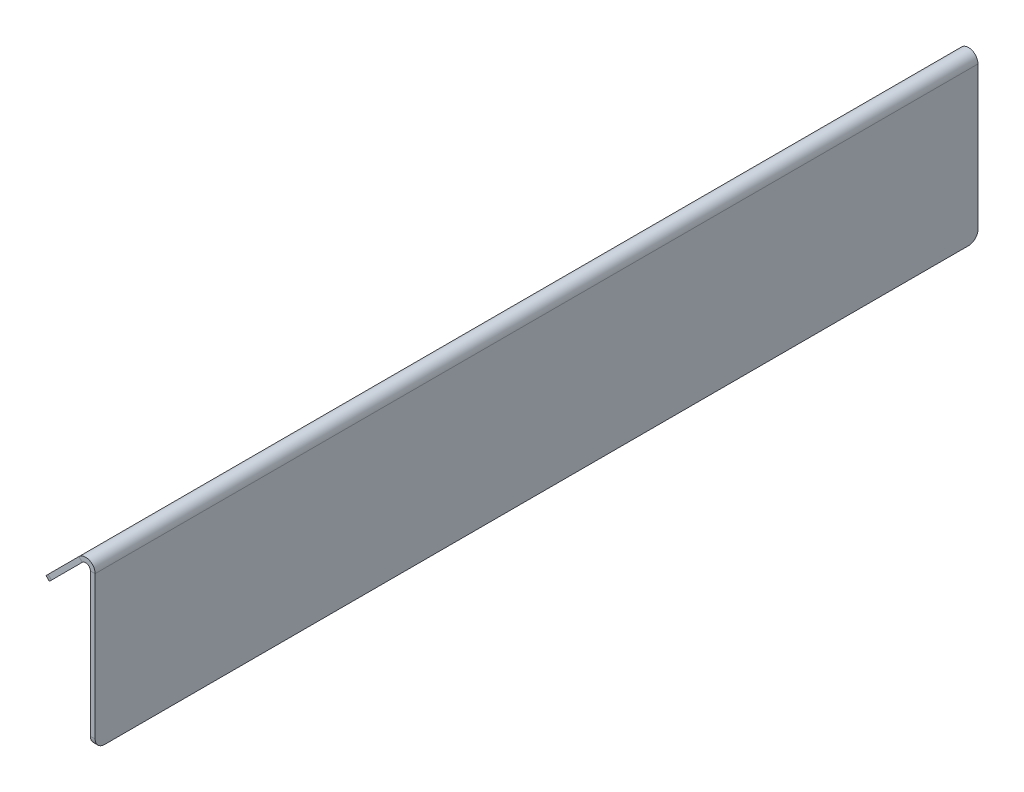
ISO-10303-21;
HEADER;
FILE_DESCRIPTION(('STEP AP214'),'2;1');
FILE_NAME('part.step','',(''),(''),'','','');
FILE_SCHEMA(('AUTOMOTIVE_DESIGN { 1 0 10303 214 1 1 1 1 }'));
ENDSEC;
DATA;
#1=APPLICATION_CONTEXT('core data for automotive mechanical design processes');
#2=APPLICATION_PROTOCOL_DEFINITION('international standard','automotive_design',2000,#1);
#3=PRODUCT_CONTEXT('',#1,'mechanical');
#4=PRODUCT('Part','Part','',(#3));
#5=PRODUCT_RELATED_PRODUCT_CATEGORY('part','',(#4));
#6=PRODUCT_DEFINITION_FORMATION('','',#4);
#7=PRODUCT_DEFINITION_CONTEXT('part definition',#1,'design');
#8=PRODUCT_DEFINITION('design','',#6,#7);
#9=PRODUCT_DEFINITION_SHAPE('','',#8);
#10=(LENGTH_UNIT() NAMED_UNIT(*) SI_UNIT(.MILLI.,.METRE.));
#11=(NAMED_UNIT(*) PLANE_ANGLE_UNIT() SI_UNIT($,.RADIAN.));
#12=(NAMED_UNIT(*) SI_UNIT($,.STERADIAN.) SOLID_ANGLE_UNIT());
#13=UNCERTAINTY_MEASURE_WITH_UNIT(LENGTH_MEASURE(1.E-05),#10,'distance_accuracy_value','');
#14=(GEOMETRIC_REPRESENTATION_CONTEXT(3) GLOBAL_UNCERTAINTY_ASSIGNED_CONTEXT((#13)) GLOBAL_UNIT_ASSIGNED_CONTEXT((#10,
#11,#12)) REPRESENTATION_CONTEXT('',''));
#15=CARTESIAN_POINT('',(0.,0.,0.));
#16=DIRECTION('',(0.,0.,1.));
#17=DIRECTION('',(1.,0.,0.));
#18=AXIS2_PLACEMENT_3D('',#15,#16,#17);
#19=CARTESIAN_POINT('',(-3.175,0.,-590.55));
#20=DIRECTION('',(0.,0.,-1.));
#21=DIRECTION('',(-1.,0.,0.));
#22=AXIS2_PLACEMENT_3D('',#19,#20,#21);
#23=PLANE('',#22);
#24=DIRECTION('',(0.,1.,0.));
#25=VECTOR('',#24,1.);
#26=CARTESIAN_POINT('',(0.,0.,-590.55));
#27=LINE('',#26,#25);
#28=CARTESIAN_POINT('',(0.,6.35,-590.55));
#29=VERTEX_POINT('',#28);
#30=CARTESIAN_POINT('',(0.,102.144743878931,-590.55));
#31=VERTEX_POINT('',#30);
#32=EDGE_CURVE('E216',#29,#31,#27,.T.);
#33=ORIENTED_EDGE('',*,*,#32,.F.);
#34=DIRECTION('',(1.,0.,0.));
#35=VECTOR('',#34,1.);
#36=CARTESIAN_POINT('',(-3.175,6.35,-590.55));
#37=LINE('',#36,#35);
#38=CARTESIAN_POINT('',(-3.175,6.35,-590.55));
#39=VERTEX_POINT('',#38);
#40=EDGE_CURVE('E236',#29,#39,#37,.F.);
#41=ORIENTED_EDGE('',*,*,#40,.T.);
#42=DIRECTION('',(0.,1.,0.));
#43=VECTOR('',#42,1.);
#44=CARTESIAN_POINT('',(-3.175,0.,-590.55));
#45=LINE('',#44,#43);
#46=CARTESIAN_POINT('',(-3.175,102.144743878931,-590.55));
#47=VERTEX_POINT('',#46);
#48=EDGE_CURVE('E219',#39,#47,#45,.T.);
#49=ORIENTED_EDGE('',*,*,#48,.T.);
#50=DIRECTION('',(1.,0.,0.));
#51=VECTOR('',#50,1.);
#52=CARTESIAN_POINT('',(-3.175,102.144743878931,-590.55));
#53=LINE('',#52,#51);
#54=EDGE_CURVE('E198',#47,#31,#53,.T.);
#55=ORIENTED_EDGE('',*,*,#54,.T.);
#56=EDGE_LOOP('',(#33,#41,#49,#55));
#57=FACE_BOUND('',#56,.T.);
#58=ADVANCED_FACE('F58',(#57),#23,.T.);
#59=CARTESIAN_POINT('',(-3.175,0.,0.));
#60=DIRECTION('',(-1.,0.,0.));
#61=DIRECTION('',(0.,0.,1.));
#62=AXIS2_PLACEMENT_3D('',#59,#60,#61);
#63=PLANE('',#62);
#64=ORIENTED_EDGE('',*,*,#48,.F.);
#65=CARTESIAN_POINT('',(-3.175,6.35,-584.2));
#66=DIRECTION('',(-1.,0.,0.));
#67=DIRECTION('',(0.,0.,1.));
#68=AXIS2_PLACEMENT_3D('',#65,#66,#67);
#69=CIRCLE('',#68,6.35);
#70=CARTESIAN_POINT('',(-3.175,0.,-584.2));
#71=VERTEX_POINT('',#70);
#72=EDGE_CURVE('E240',#39,#71,#69,.T.);
#73=ORIENTED_EDGE('',*,*,#72,.T.);
#74=DIRECTION('',(0.,0.,-1.));
#75=VECTOR('',#74,1.);
#76=CARTESIAN_POINT('',(-3.175,0.,0.));
#77=LINE('',#76,#75);
#78=CARTESIAN_POINT('',(-3.175,0.,-6.35));
#79=VERTEX_POINT('',#78);
#80=EDGE_CURVE('E215',#79,#71,#77,.T.);
#81=ORIENTED_EDGE('',*,*,#80,.F.);
#82=CARTESIAN_POINT('',(-3.175,6.35,-6.35));
#83=DIRECTION('',(-1.,0.,0.));
#84=DIRECTION('',(0.,0.,1.));
#85=AXIS2_PLACEMENT_3D('',#82,#83,#84);
#86=CIRCLE('',#85,6.35);
#87=CARTESIAN_POINT('',(-3.175,6.35,0.));
#88=VERTEX_POINT('',#87);
#89=EDGE_CURVE('E238',#79,#88,#86,.T.);
#90=ORIENTED_EDGE('',*,*,#89,.T.);
#91=DIRECTION('',(0.,-1.,0.));
#92=VECTOR('',#91,1.);
#93=CARTESIAN_POINT('',(-3.175,0.,0.));
#94=LINE('',#93,#92);
#95=CARTESIAN_POINT('',(-3.175,102.144743878931,0.));
#96=VERTEX_POINT('',#95);
#97=EDGE_CURVE('E212',#96,#88,#94,.T.);
#98=ORIENTED_EDGE('',*,*,#97,.F.);
#99=DIRECTION('',(0.,0.,-1.));
#100=VECTOR('',#99,1.);
#101=CARTESIAN_POINT('',(-3.175,102.144743878931,-590.55));
#102=LINE('',#101,#100);
#103=EDGE_CURVE('E202',#47,#96,#102,.F.);
#104=ORIENTED_EDGE('',*,*,#103,.F.);
#105=EDGE_LOOP('',(#64,#73,#81,#90,#98,#104));
#106=FACE_BOUND('',#105,.T.);
#107=ADVANCED_FACE('F304',(#106),#63,.T.);
#108=CARTESIAN_POINT('',(0.,0.,0.));
#109=DIRECTION('',(-1.,0.,0.));
#110=DIRECTION('',(0.,0.,1.));
#111=AXIS2_PLACEMENT_3D('',#108,#109,#110);
#112=PLANE('',#111);
#113=DIRECTION('',(0.,0.,-1.));
#114=VECTOR('',#113,1.);
#115=CARTESIAN_POINT('',(0.,0.,0.));
#116=LINE('',#115,#114);
#117=CARTESIAN_POINT('',(0.,0.,-6.35));
#118=VERTEX_POINT('',#117);
#119=CARTESIAN_POINT('',(0.,0.,-584.2));
#120=VERTEX_POINT('',#119);
#121=EDGE_CURVE('E224',#118,#120,#116,.T.);
#122=ORIENTED_EDGE('',*,*,#121,.T.);
#123=CARTESIAN_POINT('',(0.,6.35,-584.2));
#124=DIRECTION('',(-1.,0.,0.));
#125=DIRECTION('',(0.,0.,1.));
#126=AXIS2_PLACEMENT_3D('',#123,#124,#125);
#127=CIRCLE('',#126,6.35);
#128=EDGE_CURVE('E234',#120,#29,#127,.F.);
#129=ORIENTED_EDGE('',*,*,#128,.T.);
#130=ORIENTED_EDGE('',*,*,#32,.T.);
#131=DIRECTION('',(0.,0.,-1.));
#132=VECTOR('',#131,1.);
#133=CARTESIAN_POINT('',(0.,102.144743878931,-590.55));
#134=LINE('',#133,#132);
#135=CARTESIAN_POINT('',(0.,102.144743878931,0.));
#136=VERTEX_POINT('',#135);
#137=EDGE_CURVE('E160',#31,#136,#134,.F.);
#138=ORIENTED_EDGE('',*,*,#137,.T.);
#139=DIRECTION('',(0.,-1.,0.));
#140=VECTOR('',#139,1.);
#141=CARTESIAN_POINT('',(0.,0.,0.));
#142=LINE('',#141,#140);
#143=CARTESIAN_POINT('',(0.,6.35,0.));
#144=VERTEX_POINT('',#143);
#145=EDGE_CURVE('E209',#136,#144,#142,.T.);
#146=ORIENTED_EDGE('',*,*,#145,.T.);
#147=CARTESIAN_POINT('',(0.,6.35,-6.35));
#148=DIRECTION('',(-1.,0.,0.));
#149=DIRECTION('',(0.,0.,1.));
#150=AXIS2_PLACEMENT_3D('',#147,#148,#149);
#151=CIRCLE('',#150,6.35);
#152=EDGE_CURVE('E232',#144,#118,#151,.F.);
#153=ORIENTED_EDGE('',*,*,#152,.T.);
#154=EDGE_LOOP('',(#122,#129,#130,#138,#146,#153));
#155=FACE_BOUND('',#154,.T.);
#156=ADVANCED_FACE('F310',(#155),#112,.F.);
#157=CARTESIAN_POINT('',(-3.175,0.,0.));
#158=DIRECTION('',(0.,0.,1.));
#159=DIRECTION('',(1.,0.,0.));
#160=AXIS2_PLACEMENT_3D('',#157,#158,#159);
#161=PLANE('',#160);
#162=ORIENTED_EDGE('',*,*,#97,.T.);
#163=DIRECTION('',(1.,0.,0.));
#164=VECTOR('',#163,1.);
#165=CARTESIAN_POINT('',(-3.175,6.35,0.));
#166=LINE('',#165,#164);
#167=EDGE_CURVE('E13',#88,#144,#166,.T.);
#168=ORIENTED_EDGE('',*,*,#167,.T.);
#169=ORIENTED_EDGE('',*,*,#145,.F.);
#170=DIRECTION('',(1.,0.,0.));
#171=VECTOR('',#170,1.);
#172=CARTESIAN_POINT('',(-3.175,102.144743878931,0.));
#173=LINE('',#172,#171);
#174=EDGE_CURVE('E206',#96,#136,#173,.T.);
#175=ORIENTED_EDGE('',*,*,#174,.F.);
#176=EDGE_LOOP('',(#162,#168,#169,#175));
#177=FACE_BOUND('',#176,.T.);
#178=ADVANCED_FACE('F300',(#177),#161,.T.);
#179=CARTESIAN_POINT('',(-3.175,0.,0.));
#180=DIRECTION('',(0.,-1.,0.));
#181=DIRECTION('',(0.,0.,-1.));
#182=AXIS2_PLACEMENT_3D('',#179,#180,#181);
#183=PLANE('',#182);
#184=ORIENTED_EDGE('',*,*,#80,.T.);
#185=DIRECTION('',(1.,0.,0.));
#186=VECTOR('',#185,1.);
#187=CARTESIAN_POINT('',(-3.175,0.,-584.2));
#188=LINE('',#187,#186);
#189=EDGE_CURVE('E229',#71,#120,#188,.T.);
#190=ORIENTED_EDGE('',*,*,#189,.T.);
#191=ORIENTED_EDGE('',*,*,#121,.F.);
#192=DIRECTION('',(1.,0.,0.));
#193=VECTOR('',#192,1.);
#194=CARTESIAN_POINT('',(-3.175,0.,-6.35));
#195=LINE('',#194,#193);
#196=EDGE_CURVE('E221',#118,#79,#195,.F.);
#197=ORIENTED_EDGE('',*,*,#196,.T.);
#198=EDGE_LOOP('',(#184,#190,#191,#197));
#199=FACE_BOUND('',#198,.T.);
#200=ADVANCED_FACE('F320',(#199),#183,.T.);
#201=CARTESIAN_POINT('',(-6.35000000000001,102.144743878931,0.));
#202=DIRECTION('',(0.,0.,1.));
#203=DIRECTION('',(1.,0.,0.));
#204=AXIS2_PLACEMENT_3D('',#201,#202,#203);
#205=PLANE('',#204);
#206=DIRECTION('',(0.707106781186546,-0.707106781186549,0.));
#207=VECTOR('',#206,1.);
#208=CARTESIAN_POINT('',(-10.8401280605346,106.634871939465,0.));
#209=LINE('',#208,#207);
#210=CARTESIAN_POINT('',(-8.5950640302673,104.389807909198,0.));
#211=VERTEX_POINT('',#210);
#212=CARTESIAN_POINT('',(-10.8401280605346,106.634871939465,0.));
#213=VERTEX_POINT('',#212);
#214=EDGE_CURVE('E193',#211,#213,#209,.F.);
#215=ORIENTED_EDGE('',*,*,#214,.F.);
#216=CARTESIAN_POINT('',(-6.35000000000001,102.144743878931,0.));
#217=DIRECTION('',(0.,0.,-1.));
#218=DIRECTION('',(-1.,0.,0.));
#219=AXIS2_PLACEMENT_3D('',#216,#217,#218);
#220=CIRCLE('',#219,3.17500000000001);
#221=EDGE_CURVE('E163',#96,#211,#220,.F.);
#222=ORIENTED_EDGE('',*,*,#221,.F.);
#223=ORIENTED_EDGE('',*,*,#174,.T.);
#224=CARTESIAN_POINT('',(-6.35000000000001,102.144743878931,0.));
#225=DIRECTION('',(0.,0.,-1.));
#226=DIRECTION('',(-1.,0.,0.));
#227=AXIS2_PLACEMENT_3D('',#224,#225,#226);
#228=CIRCLE('',#227,6.35000000000001);
#229=EDGE_CURVE('E197',#136,#213,#228,.F.);
#230=ORIENTED_EDGE('',*,*,#229,.T.);
#231=EDGE_LOOP('',(#215,#222,#223,#230));
#232=FACE_BOUND('',#231,.T.);
#233=ADVANCED_FACE('F296',(#232),#205,.T.);
#234=CARTESIAN_POINT('',(-6.35000000000001,102.144743878931,-590.55));
#235=DIRECTION('',(0.,0.,1.));
#236=DIRECTION('',(1.,0.,0.));
#237=AXIS2_PLACEMENT_3D('',#234,#235,#236);
#238=PLANE('',#237);
#239=CARTESIAN_POINT('',(-6.35000000000001,102.144743878931,-590.55));
#240=DIRECTION('',(0.,0.,-1.));
#241=DIRECTION('',(-1.,0.,0.));
#242=AXIS2_PLACEMENT_3D('',#239,#240,#241);
#243=CIRCLE('',#242,3.17500000000001);
#244=CARTESIAN_POINT('',(-8.5950640302673,104.389807909198,-590.55));
#245=VERTEX_POINT('',#244);
#246=EDGE_CURVE('E170',#245,#47,#243,.T.);
#247=ORIENTED_EDGE('',*,*,#246,.F.);
#248=DIRECTION('',(0.707106781186546,-0.707106781186549,0.));
#249=VECTOR('',#248,1.);
#250=CARTESIAN_POINT('',(-8.5950640302673,104.389807909198,-590.55));
#251=LINE('',#250,#249);
#252=CARTESIAN_POINT('',(-10.8401280605346,106.634871939465,-590.55));
#253=VERTEX_POINT('',#252);
#254=EDGE_CURVE('E167',#245,#253,#251,.F.);
#255=ORIENTED_EDGE('',*,*,#254,.T.);
#256=CARTESIAN_POINT('',(-6.35000000000001,102.144743878931,-590.55));
#257=DIRECTION('',(0.,0.,-1.));
#258=DIRECTION('',(-1.,0.,0.));
#259=AXIS2_PLACEMENT_3D('',#256,#257,#258);
#260=CIRCLE('',#259,6.35000000000001);
#261=EDGE_CURVE('E153',#253,#31,#260,.T.);
#262=ORIENTED_EDGE('',*,*,#261,.T.);
#263=ORIENTED_EDGE('',*,*,#54,.F.);
#264=EDGE_LOOP('',(#247,#255,#262,#263));
#265=FACE_BOUND('',#264,.T.);
#266=ADVANCED_FACE('F168',(#265),#238,.F.);
#267=CARTESIAN_POINT('',(-6.35000000000001,102.144743878931,-590.55));
#268=DIRECTION('',(0.,0.,-1.));
#269=DIRECTION('',(-0.707106781186546,0.707106781186549,0.));
#270=AXIS2_PLACEMENT_3D('',#267,#268,#269);
#271=CYLINDRICAL_SURFACE('',#270,6.35000000000001);
#272=ORIENTED_EDGE('',*,*,#137,.F.);
#273=ORIENTED_EDGE('',*,*,#261,.F.);
#274=DIRECTION('',(0.,0.,-1.));
#275=VECTOR('',#274,1.);
#276=CARTESIAN_POINT('',(-10.8401280605346,106.634871939465,0.));
#277=LINE('',#276,#275);
#278=EDGE_CURVE('E158',#253,#213,#277,.F.);
#279=ORIENTED_EDGE('',*,*,#278,.T.);
#280=ORIENTED_EDGE('',*,*,#229,.F.);
#281=EDGE_LOOP('',(#272,#273,#279,#280));
#282=FACE_BOUND('',#281,.T.);
#283=ADVANCED_FACE('F155',(#282),#271,.T.);
#284=CARTESIAN_POINT('',(-6.35000000000001,102.144743878931,-590.55));
#285=DIRECTION('',(0.,0.,-1.));
#286=DIRECTION('',(-0.707106781186546,0.707106781186549,0.));
#287=AXIS2_PLACEMENT_3D('',#284,#285,#286);
#288=CYLINDRICAL_SURFACE('',#287,3.17500000000001);
#289=ORIENTED_EDGE('',*,*,#103,.T.);
#290=ORIENTED_EDGE('',*,*,#221,.T.);
#291=DIRECTION('',(0.,0.,-1.));
#292=VECTOR('',#291,1.);
#293=CARTESIAN_POINT('',(-8.59506403026729,104.389807909198,0.));
#294=LINE('',#293,#292);
#295=EDGE_CURVE('E172',#211,#245,#294,.T.);
#296=ORIENTED_EDGE('',*,*,#295,.T.);
#297=ORIENTED_EDGE('',*,*,#246,.T.);
#298=EDGE_LOOP('',(#289,#290,#296,#297));
#299=FACE_BOUND('',#298,.T.);
#300=ADVANCED_FACE('F292',(#299),#288,.F.);
#301=CARTESIAN_POINT('',(-35.9210244842767,81.5539755157234,-590.55));
#302=DIRECTION('',(0.,0.,1.));
#303=DIRECTION('',(1.,0.,0.));
#304=AXIS2_PLACEMENT_3D('',#301,#302,#303);
#305=PLANE('',#304);
#306=DIRECTION('',(0.707106781186549,0.707106781186546,0.));
#307=VECTOR('',#306,1.);
#308=CARTESIAN_POINT('',(-33.6759604540094,79.3089114854562,-590.55));
#309=LINE('',#308,#307);
#310=CARTESIAN_POINT('',(-29.1858323934748,83.7990395459907,-590.55));
#311=VERTEX_POINT('',#310);
#312=EDGE_CURVE('E178',#245,#311,#309,.F.);
#313=ORIENTED_EDGE('',*,*,#312,.T.);
#314=DIRECTION('',(0.707106781186546,-0.707106781186549,0.));
#315=VECTOR('',#314,1.);
#316=CARTESIAN_POINT('',(-31.4308964237421,86.044103576258,-590.55));
#317=LINE('',#316,#315);
#318=CARTESIAN_POINT('',(-31.4308964237421,86.044103576258,-590.55));
#319=VERTEX_POINT('',#318);
#320=EDGE_CURVE('E83',#311,#319,#317,.F.);
#321=ORIENTED_EDGE('',*,*,#320,.T.);
#322=DIRECTION('',(-0.707106781186549,-0.707106781186546,0.));
#323=VECTOR('',#322,1.);
#324=CARTESIAN_POINT('',(-60.9825640302673,56.4924359697329,-590.55));
#325=LINE('',#324,#323);
#326=EDGE_CURVE('E175',#253,#319,#325,.T.);
#327=ORIENTED_EDGE('',*,*,#326,.F.);
#328=ORIENTED_EDGE('',*,*,#254,.F.);
#329=EDGE_LOOP('',(#313,#321,#327,#328));
#330=FACE_BOUND('',#329,.T.);
#331=ADVANCED_FACE('F180',(#330),#305,.F.);
#332=CARTESIAN_POINT('',(-5.42006403026728,112.054935969733,0.));
#333=DIRECTION('',(0.,0.,-1.));
#334=DIRECTION('',(-1.,0.,0.));
#335=AXIS2_PLACEMENT_3D('',#332,#333,#334);
#336=PLANE('',#335);
#337=DIRECTION('',(0.707106781186549,0.707106781186546,0.));
#338=VECTOR('',#337,1.);
#339=CARTESIAN_POINT('',(-60.9825640302673,56.4924359697329,0.));
#340=LINE('',#339,#338);
#341=CARTESIAN_POINT('',(-31.4308964237421,86.044103576258,0.));
#342=VERTEX_POINT('',#341);
#343=EDGE_CURVE('E177',#342,#213,#340,.T.);
#344=ORIENTED_EDGE('',*,*,#343,.F.);
#345=DIRECTION('',(0.707106781186546,-0.707106781186549,0.));
#346=VECTOR('',#345,1.);
#347=CARTESIAN_POINT('',(-31.4308964237421,86.044103576258,0.));
#348=LINE('',#347,#346);
#349=CARTESIAN_POINT('',(-29.1858323934748,83.7990395459907,0.));
#350=VERTEX_POINT('',#349);
#351=EDGE_CURVE('E67',#342,#350,#348,.T.);
#352=ORIENTED_EDGE('',*,*,#351,.T.);
#353=DIRECTION('',(-0.707106781186549,-0.707106781186546,0.));
#354=VECTOR('',#353,1.);
#355=CARTESIAN_POINT('',(-3.17500000000001,109.809871939465,0.));
#356=LINE('',#355,#354);
#357=EDGE_CURVE('E182',#350,#211,#356,.F.);
#358=ORIENTED_EDGE('',*,*,#357,.T.);
#359=ORIENTED_EDGE('',*,*,#214,.T.);
#360=EDGE_LOOP('',(#344,#352,#358,#359));
#361=FACE_BOUND('',#360,.T.);
#362=ADVANCED_FACE('F288',(#361),#336,.F.);
#363=CARTESIAN_POINT('',(-60.9825640302673,56.4924359697329,0.));
#364=DIRECTION('',(0.707106781186546,-0.707106781186549,0.));
#365=DIRECTION('',(0.707106781186549,0.707106781186546,0.));
#366=AXIS2_PLACEMENT_3D('',#363,#364,#365);
#367=PLANE('',#366);
#368=CARTESIAN_POINT('',(-24.3105122421384,93.1644877578618,-542.925));
#369=DIRECTION('',(-0.707106781186546,0.707106781186549,0.));
#370=DIRECTION('',(-0.707106781186549,-0.707106781186546,0.));
#371=AXIS2_PLACEMENT_3D('',#368,#369,#370);
#372=CIRCLE('',#371,2.45745000000001);
#373=CARTESIAN_POINT('',(-26.0481918015652,91.4268081984349,-542.925));
#374=VERTEX_POINT('',#373);
#375=EDGE_CURVE('E260',#374,#374,#372,.T.);
#376=ORIENTED_EDGE('',*,*,#375,.F.);
#377=EDGE_LOOP('',(#376));
#378=FACE_BOUND('',#377,.T.);
#379=CARTESIAN_POINT('',(-24.3105122421384,93.1644877578618,-295.275));
#380=DIRECTION('',(-0.707106781186546,0.707106781186549,0.));
#381=DIRECTION('',(-0.707106781186549,-0.707106781186546,0.));
#382=AXIS2_PLACEMENT_3D('',#379,#380,#381);
#383=CIRCLE('',#382,2.45745000000002);
#384=CARTESIAN_POINT('',(-26.0481918015653,91.4268081984349,-295.275));
#385=VERTEX_POINT('',#384);
#386=EDGE_CURVE('E528',#385,#385,#383,.T.);
#387=ORIENTED_EDGE('',*,*,#386,.F.);
#388=EDGE_LOOP('',(#387));
#389=FACE_BOUND('',#388,.T.);
#390=CARTESIAN_POINT('',(-24.3105122421384,93.1644877578618,-47.6249999999999));
#391=DIRECTION('',(-0.707106781186546,0.707106781186549,0.));
#392=DIRECTION('',(-0.707106781186549,-0.707106781186546,0.));
#393=AXIS2_PLACEMENT_3D('',#390,#391,#392);
#394=CIRCLE('',#393,2.45745);
#395=CARTESIAN_POINT('',(-26.0481918015652,91.4268081984349,-47.6249999999999));
#396=VERTEX_POINT('',#395);
#397=EDGE_CURVE('E530',#396,#396,#394,.T.);
#398=ORIENTED_EDGE('',*,*,#397,.F.);
#399=EDGE_LOOP('',(#398));
#400=FACE_BOUND('',#399,.T.);
#401=ORIENTED_EDGE('',*,*,#326,.T.);
#402=CARTESIAN_POINT('',(-31.4308964237421,86.044103576258,-584.2));
#403=DIRECTION('',(0.707106781186546,-0.707106781186549,0.));
#404=DIRECTION('',(0.707106781186549,0.707106781186546,0.));
#405=AXIS2_PLACEMENT_3D('',#402,#403,#404);
#406=CIRCLE('',#405,6.35);
#407=CARTESIAN_POINT('',(-35.9210244842767,81.5539755157235,-584.2));
#408=VERTEX_POINT('',#407);
#409=EDGE_CURVE('E253',#319,#408,#406,.F.);
#410=ORIENTED_EDGE('',*,*,#409,.T.);
#411=DIRECTION('',(0.,0.,1.));
#412=VECTOR('',#411,1.);
#413=CARTESIAN_POINT('',(-35.9210244842767,81.5539755157235,0.));
#414=LINE('',#413,#412);
#415=CARTESIAN_POINT('',(-35.9210244842767,81.5539755157235,-6.35));
#416=VERTEX_POINT('',#415);
#417=EDGE_CURVE('E181',#408,#416,#414,.T.);
#418=ORIENTED_EDGE('',*,*,#417,.T.);
#419=CARTESIAN_POINT('',(-31.4308964237421,86.044103576258,-6.35));
#420=DIRECTION('',(0.707106781186546,-0.707106781186549,0.));
#421=DIRECTION('',(0.707106781186549,0.707106781186546,0.));
#422=AXIS2_PLACEMENT_3D('',#419,#420,#421);
#423=CIRCLE('',#422,6.35);
#424=EDGE_CURVE('E75',#416,#342,#423,.F.);
#425=ORIENTED_EDGE('',*,*,#424,.T.);
#426=ORIENTED_EDGE('',*,*,#343,.T.);
#427=ORIENTED_EDGE('',*,*,#278,.F.);
#428=EDGE_LOOP('',(#401,#410,#418,#425,#426,#427));
#429=FACE_BOUND('',#428,.T.);
#430=ADVANCED_FACE('F174',(#378,#389,#400,#429),#367,.F.);
#431=CARTESIAN_POINT('',(-58.7375,54.2473719394656,0.));
#432=DIRECTION('',(0.707106781186546,-0.707106781186549,0.));
#433=DIRECTION('',(0.707106781186549,0.707106781186546,0.));
#434=AXIS2_PLACEMENT_3D('',#431,#432,#433);
#435=PLANE('',#434);
#436=CARTESIAN_POINT('',(-22.0654482118711,90.9194237275945,-542.925));
#437=DIRECTION('',(0.707106781186546,-0.707106781186549,0.));
#438=DIRECTION('',(0.707106781186549,0.707106781186546,0.));
#439=AXIS2_PLACEMENT_3D('',#436,#437,#438);
#440=CIRCLE('',#439,2.45745000000001);
#441=CARTESIAN_POINT('',(-20.3277686524442,92.6571032870214,-542.925));
#442=VERTEX_POINT('',#441);
#443=EDGE_CURVE('E62',#442,#442,#440,.T.);
#444=ORIENTED_EDGE('',*,*,#443,.F.);
#445=EDGE_LOOP('',(#444));
#446=FACE_BOUND('',#445,.T.);
#447=CARTESIAN_POINT('',(-22.0654482118711,90.9194237275945,-295.275));
#448=DIRECTION('',(0.707106781186546,-0.707106781186549,0.));
#449=DIRECTION('',(0.707106781186549,0.707106781186546,0.));
#450=AXIS2_PLACEMENT_3D('',#447,#448,#449);
#451=CIRCLE('',#450,2.45745000000002);
#452=CARTESIAN_POINT('',(-20.3277686524442,92.6571032870214,-295.275));
#453=VERTEX_POINT('',#452);
#454=EDGE_CURVE('E259',#453,#453,#451,.T.);
#455=ORIENTED_EDGE('',*,*,#454,.F.);
#456=EDGE_LOOP('',(#455));
#457=FACE_BOUND('',#456,.T.);
#458=CARTESIAN_POINT('',(-22.0654482118711,90.9194237275945,-47.6249999999999));
#459=DIRECTION('',(0.707106781186546,-0.707106781186549,0.));
#460=DIRECTION('',(0.707106781186549,0.707106781186546,0.));
#461=AXIS2_PLACEMENT_3D('',#458,#459,#460);
#462=CIRCLE('',#461,2.45745);
#463=CARTESIAN_POINT('',(-20.3277686524442,92.6571032870213,-47.6249999999999));
#464=VERTEX_POINT('',#463);
#465=EDGE_CURVE('E257',#464,#464,#462,.T.);
#466=ORIENTED_EDGE('',*,*,#465,.F.);
#467=EDGE_LOOP('',(#466));
#468=FACE_BOUND('',#467,.T.);
#469=DIRECTION('',(0.,0.,-1.));
#470=VECTOR('',#469,1.);
#471=CARTESIAN_POINT('',(-33.6759604540094,79.3089114854562,0.));
#472=LINE('',#471,#470);
#473=CARTESIAN_POINT('',(-33.6759604540094,79.3089114854562,-584.2));
#474=VERTEX_POINT('',#473);
#475=CARTESIAN_POINT('',(-33.6759604540094,79.3089114854562,-6.35));
#476=VERTEX_POINT('',#475);
#477=EDGE_CURVE('E185',#474,#476,#472,.F.);
#478=ORIENTED_EDGE('',*,*,#477,.F.);
#479=CARTESIAN_POINT('',(-29.1858323934748,83.7990395459907,-584.2));
#480=DIRECTION('',(0.707106781186546,-0.707106781186549,0.));
#481=DIRECTION('',(0.707106781186549,0.707106781186546,0.));
#482=AXIS2_PLACEMENT_3D('',#479,#480,#481);
#483=CIRCLE('',#482,6.35);
#484=EDGE_CURVE('E249',#474,#311,#483,.T.);
#485=ORIENTED_EDGE('',*,*,#484,.T.);
#486=ORIENTED_EDGE('',*,*,#312,.F.);
#487=ORIENTED_EDGE('',*,*,#295,.F.);
#488=ORIENTED_EDGE('',*,*,#357,.F.);
#489=CARTESIAN_POINT('',(-29.1858323934748,83.7990395459907,-6.35));
#490=DIRECTION('',(0.707106781186546,-0.707106781186549,0.));
#491=DIRECTION('',(0.707106781186549,0.707106781186546,0.));
#492=AXIS2_PLACEMENT_3D('',#489,#490,#491);
#493=CIRCLE('',#492,6.35);
#494=EDGE_CURVE('E247',#350,#476,#493,.T.);
#495=ORIENTED_EDGE('',*,*,#494,.T.);
#496=EDGE_LOOP('',(#478,#485,#486,#487,#488,#495));
#497=FACE_BOUND('',#496,.T.);
#498=ADVANCED_FACE('F270',(#446,#457,#468,#497),#435,.T.);
#499=CARTESIAN_POINT('',(-35.9210244842767,81.5539755157234,0.));
#500=DIRECTION('',(0.707106781186549,0.707106781186546,0.));
#501=DIRECTION('',(-0.707106781186546,0.707106781186549,0.));
#502=AXIS2_PLACEMENT_3D('',#499,#500,#501);
#503=PLANE('',#502);
#504=ORIENTED_EDGE('',*,*,#417,.F.);
#505=DIRECTION('',(0.707106781186546,-0.707106781186549,0.));
#506=VECTOR('',#505,1.);
#507=CARTESIAN_POINT('',(-35.9210244842767,81.5539755157234,-584.2));
#508=LINE('',#507,#506);
#509=EDGE_CURVE('E244',#408,#474,#508,.T.);
#510=ORIENTED_EDGE('',*,*,#509,.T.);
#511=ORIENTED_EDGE('',*,*,#477,.T.);
#512=DIRECTION('',(0.707106781186546,-0.707106781186549,0.));
#513=VECTOR('',#512,1.);
#514=CARTESIAN_POINT('',(-35.9210244842767,81.5539755157234,-6.35));
#515=LINE('',#514,#513);
#516=EDGE_CURVE('E242',#476,#416,#515,.F.);
#517=ORIENTED_EDGE('',*,*,#516,.T.);
#518=EDGE_LOOP('',(#504,#510,#511,#517));
#519=FACE_BOUND('',#518,.T.);
#520=ADVANCED_FACE('F273',(#519),#503,.F.);
#521=CARTESIAN_POINT('',(-3.175,6.35,-584.2));
#522=DIRECTION('',(1.,0.,0.));
#523=DIRECTION('',(0.,0.,-1.));
#524=AXIS2_PLACEMENT_3D('',#521,#522,#523);
#525=CYLINDRICAL_SURFACE('',#524,6.35);
#526=ORIENTED_EDGE('',*,*,#72,.F.);
#527=ORIENTED_EDGE('',*,*,#40,.F.);
#528=ORIENTED_EDGE('',*,*,#128,.F.);
#529=ORIENTED_EDGE('',*,*,#189,.F.);
#530=EDGE_LOOP('',(#526,#527,#528,#529));
#531=FACE_BOUND('',#530,.T.);
#532=ADVANCED_FACE('F318',(#531),#525,.T.);
#533=CARTESIAN_POINT('',(-31.4308964237421,86.044103576258,-584.2));
#534=DIRECTION('',(0.707106781186546,-0.707106781186549,0.));
#535=DIRECTION('',(0.707106781186549,0.707106781186546,0.));
#536=AXIS2_PLACEMENT_3D('',#533,#534,#535);
#537=CYLINDRICAL_SURFACE('',#536,6.35);
#538=ORIENTED_EDGE('',*,*,#409,.F.);
#539=ORIENTED_EDGE('',*,*,#320,.F.);
#540=ORIENTED_EDGE('',*,*,#484,.F.);
#541=ORIENTED_EDGE('',*,*,#509,.F.);
#542=EDGE_LOOP('',(#538,#539,#540,#541));
#543=FACE_BOUND('',#542,.T.);
#544=ADVANCED_FACE('F384',(#543),#537,.T.);
#545=CARTESIAN_POINT('',(-31.4308964237421,86.044103576258,-6.35));
#546=DIRECTION('',(0.707106781186546,-0.707106781186549,0.));
#547=DIRECTION('',(0.707106781186549,0.707106781186546,0.));
#548=AXIS2_PLACEMENT_3D('',#545,#546,#547);
#549=CYLINDRICAL_SURFACE('',#548,6.35);
#550=ORIENTED_EDGE('',*,*,#424,.F.);
#551=ORIENTED_EDGE('',*,*,#516,.F.);
#552=ORIENTED_EDGE('',*,*,#494,.F.);
#553=ORIENTED_EDGE('',*,*,#351,.F.);
#554=EDGE_LOOP('',(#550,#551,#552,#553));
#555=FACE_BOUND('',#554,.T.);
#556=ADVANCED_FACE('F285',(#555),#549,.T.);
#557=CARTESIAN_POINT('',(-3.175,6.35,-6.35));
#558=DIRECTION('',(1.,0.,0.));
#559=DIRECTION('',(0.,0.,-1.));
#560=AXIS2_PLACEMENT_3D('',#557,#558,#559);
#561=CYLINDRICAL_SURFACE('',#560,6.35);
#562=ORIENTED_EDGE('',*,*,#89,.F.);
#563=ORIENTED_EDGE('',*,*,#196,.F.);
#564=ORIENTED_EDGE('',*,*,#152,.F.);
#565=ORIENTED_EDGE('',*,*,#167,.F.);
#566=EDGE_LOOP('',(#562,#563,#564,#565));
#567=FACE_BOUND('',#566,.T.);
#568=ADVANCED_FACE('F60',(#567),#561,.T.);
#569=CARTESIAN_POINT('',(-22.0582640069742,90.9122395226976,-47.6249999999999));
#570=DIRECTION('',(-0.707106781186546,0.707106781186549,0.));
#571=DIRECTION('',(-0.707106781186549,-0.707106781186546,0.));
#572=AXIS2_PLACEMENT_3D('',#569,#570,#571);
#573=CYLINDRICAL_SURFACE('',#572,2.45745);
#574=ORIENTED_EDGE('',*,*,#465,.T.);
#575=EDGE_LOOP('',(#574));
#576=FACE_BOUND('',#575,.T.);
#577=ORIENTED_EDGE('',*,*,#397,.T.);
#578=EDGE_LOOP('',(#577));
#579=FACE_BOUND('',#578,.T.);
#580=ADVANCED_FACE('F353',(#576,#579),#573,.F.);
#581=CARTESIAN_POINT('',(-22.0582640069742,90.9122395226976,-295.275));
#582=DIRECTION('',(-0.707106781186546,0.707106781186549,0.));
#583=DIRECTION('',(-0.707106781186549,-0.707106781186546,0.));
#584=AXIS2_PLACEMENT_3D('',#581,#582,#583);
#585=CYLINDRICAL_SURFACE('',#584,2.45745000000002);
#586=ORIENTED_EDGE('',*,*,#454,.T.);
#587=EDGE_LOOP('',(#586));
#588=FACE_BOUND('',#587,.T.);
#589=ORIENTED_EDGE('',*,*,#386,.T.);
#590=EDGE_LOOP('',(#589));
#591=FACE_BOUND('',#590,.T.);
#592=ADVANCED_FACE('F356',(#588,#591),#585,.F.);
#593=CARTESIAN_POINT('',(-22.0582640069742,90.9122395226976,-542.925));
#594=DIRECTION('',(-0.707106781186546,0.707106781186549,0.));
#595=DIRECTION('',(-0.707106781186549,-0.707106781186546,0.));
#596=AXIS2_PLACEMENT_3D('',#593,#594,#595);
#597=CYLINDRICAL_SURFACE('',#596,2.45745000000001);
#598=ORIENTED_EDGE('',*,*,#443,.T.);
#599=EDGE_LOOP('',(#598));
#600=FACE_BOUND('',#599,.T.);
#601=ORIENTED_EDGE('',*,*,#375,.T.);
#602=EDGE_LOOP('',(#601));
#603=FACE_BOUND('',#602,.T.);
#604=ADVANCED_FACE('F267',(#600,#603),#597,.F.);
#605=CLOSED_SHELL('',(#58,#107,#156,#178,#200,#233,#266,#283,#300,#331,#362,#430,#498,#520,#532,
#544,#556,#568,#580,#592,#604));
#606=MANIFOLD_SOLID_BREP('B2',#605);
#607=ADVANCED_BREP_SHAPE_REPRESENTATION('',(#18,#606),#14);
#608=SHAPE_DEFINITION_REPRESENTATION(#9,#607);
ENDSEC;
END-ISO-10303-21;
